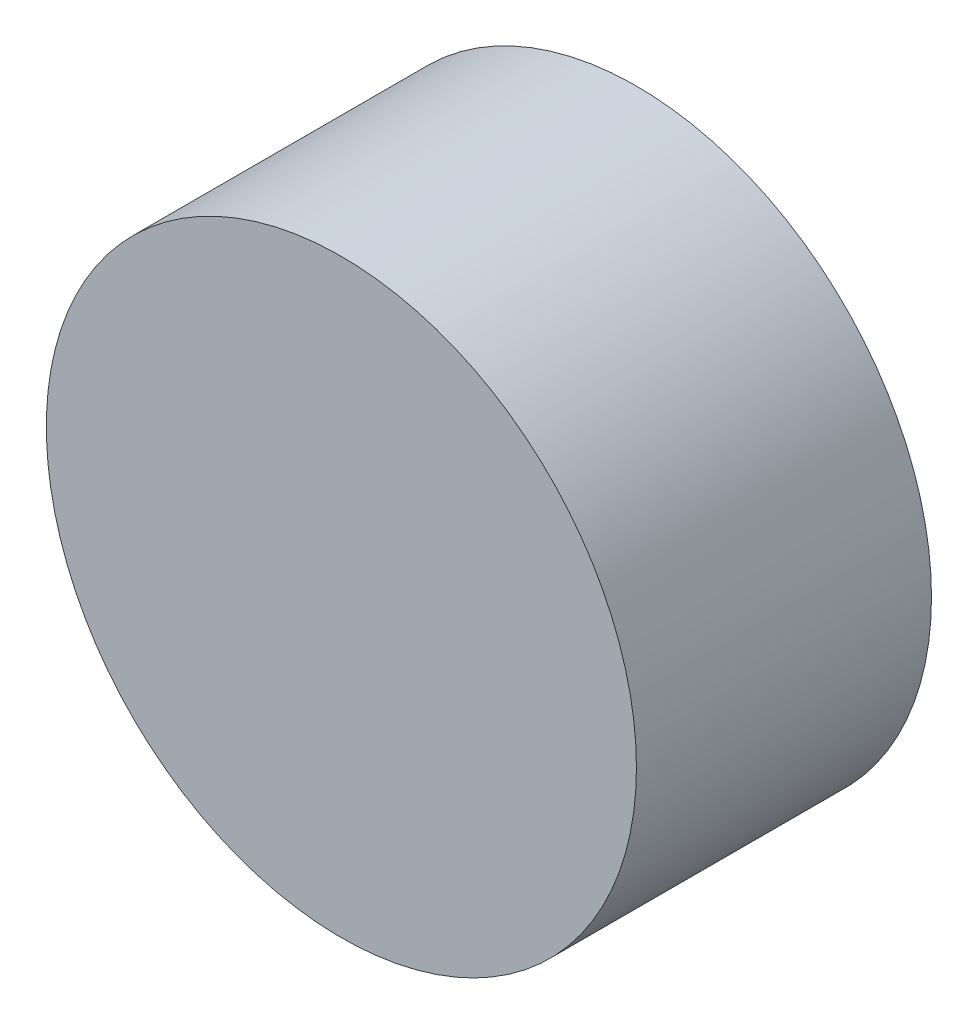
ISO-10303-21;
HEADER;
FILE_DESCRIPTION(('STEP AP214'),'2;1');
FILE_NAME('part.step','',(''),(''),'','','');
FILE_SCHEMA(('AUTOMOTIVE_DESIGN { 1 0 10303 214 1 1 1 1 }'));
ENDSEC;
DATA;
#1=APPLICATION_CONTEXT('core data for automotive mechanical design processes');
#2=APPLICATION_PROTOCOL_DEFINITION('international standard','automotive_design',2000,#1);
#3=PRODUCT_CONTEXT('',#1,'mechanical');
#4=PRODUCT('Part','Part','',(#3));
#5=PRODUCT_RELATED_PRODUCT_CATEGORY('part','',(#4));
#6=PRODUCT_DEFINITION_FORMATION('','',#4);
#7=PRODUCT_DEFINITION_CONTEXT('part definition',#1,'design');
#8=PRODUCT_DEFINITION('design','',#6,#7);
#9=PRODUCT_DEFINITION_SHAPE('','',#8);
#10=(LENGTH_UNIT() NAMED_UNIT(*) SI_UNIT(.MILLI.,.METRE.));
#11=(NAMED_UNIT(*) PLANE_ANGLE_UNIT() SI_UNIT($,.RADIAN.));
#12=(NAMED_UNIT(*) SI_UNIT($,.STERADIAN.) SOLID_ANGLE_UNIT());
#13=UNCERTAINTY_MEASURE_WITH_UNIT(LENGTH_MEASURE(1.E-05),#10,'distance_accuracy_value','');
#14=(GEOMETRIC_REPRESENTATION_CONTEXT(3) GLOBAL_UNCERTAINTY_ASSIGNED_CONTEXT((#13)) GLOBAL_UNIT_ASSIGNED_CONTEXT((#10,
#11,#12)) REPRESENTATION_CONTEXT('',''));
#15=CARTESIAN_POINT('',(0.,0.,0.));
#16=DIRECTION('',(0.,0.,1.));
#17=DIRECTION('',(1.,0.,0.));
#18=AXIS2_PLACEMENT_3D('',#15,#16,#17);
#19=CARTESIAN_POINT('',(0.,0.,3.));
#20=DIRECTION('',(0.,0.,-1.));
#21=DIRECTION('',(-1.,0.,0.));
#22=AXIS2_PLACEMENT_3D('',#19,#20,#21);
#23=CYLINDRICAL_SURFACE('',#22,3.);
#24=CARTESIAN_POINT('',(0.,0.,3.));
#25=DIRECTION('',(0.,0.,1.));
#26=DIRECTION('',(1.,0.,0.));
#27=AXIS2_PLACEMENT_3D('',#24,#25,#26);
#28=CIRCLE('',#27,3.);
#29=CARTESIAN_POINT('',(3.,0.,3.));
#30=VERTEX_POINT('',#29);
#31=EDGE_CURVE('E10',#30,#30,#28,.T.);
#32=ORIENTED_EDGE('',*,*,#31,.F.);
#33=EDGE_LOOP('',(#32));
#34=FACE_BOUND('',#33,.T.);
#35=CARTESIAN_POINT('',(0.,0.,0.));
#36=DIRECTION('',(0.,0.,1.));
#37=DIRECTION('',(1.,0.,0.));
#38=AXIS2_PLACEMENT_3D('',#35,#36,#37);
#39=CIRCLE('',#38,3.);
#40=CARTESIAN_POINT('',(3.,0.,0.));
#41=VERTEX_POINT('',#40);
#42=EDGE_CURVE('E46',#41,#41,#39,.T.);
#43=ORIENTED_EDGE('',*,*,#42,.T.);
#44=EDGE_LOOP('',(#43));
#45=FACE_BOUND('',#44,.T.);
#46=ADVANCED_FACE('F43',(#34,#45),#23,.T.);
#47=CARTESIAN_POINT('',(0.,0.,3.));
#48=DIRECTION('',(0.,0.,1.));
#49=DIRECTION('',(1.,0.,0.));
#50=AXIS2_PLACEMENT_3D('',#47,#48,#49);
#51=PLANE('',#50);
#52=ORIENTED_EDGE('',*,*,#31,.T.);
#53=EDGE_LOOP('',(#52));
#54=FACE_BOUND('',#53,.T.);
#55=ADVANCED_FACE('F58',(#54),#51,.T.);
#56=CARTESIAN_POINT('',(0.,0.,0.));
#57=DIRECTION('',(0.,0.,1.));
#58=DIRECTION('',(1.,0.,0.));
#59=AXIS2_PLACEMENT_3D('',#56,#57,#58);
#60=PLANE('',#59);
#61=ORIENTED_EDGE('',*,*,#42,.F.);
#62=EDGE_LOOP('',(#61));
#63=FACE_BOUND('',#62,.T.);
#64=ADVANCED_FACE('F56',(#63),#60,.F.);
#65=CLOSED_SHELL('',(#46,#55,#64));
#66=MANIFOLD_SOLID_BREP('B2',#65);
#67=ADVANCED_BREP_SHAPE_REPRESENTATION('',(#18,#66),#14);
#68=SHAPE_DEFINITION_REPRESENTATION(#9,#67);
ENDSEC;
END-ISO-10303-21;
